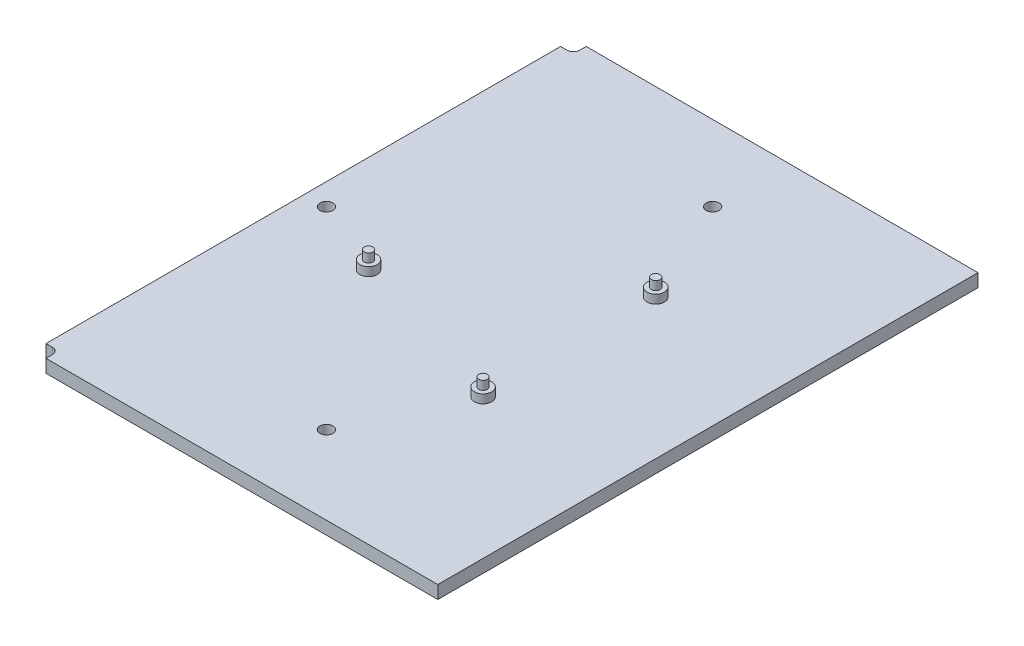
ISO-10303-21;
HEADER;
FILE_DESCRIPTION(('STEP AP214'),'2;1');
FILE_NAME('part.step','',(''),(''),'','','');
FILE_SCHEMA(('AUTOMOTIVE_DESIGN { 1 0 10303 214 1 1 1 1 }'));
ENDSEC;
DATA;
#1=APPLICATION_CONTEXT('core data for automotive mechanical design processes');
#2=APPLICATION_PROTOCOL_DEFINITION('international standard','automotive_design',2000,#1);
#3=PRODUCT_CONTEXT('',#1,'mechanical');
#4=PRODUCT('Part','Part','',(#3));
#5=PRODUCT_RELATED_PRODUCT_CATEGORY('part','',(#4));
#6=PRODUCT_DEFINITION_FORMATION('','',#4);
#7=PRODUCT_DEFINITION_CONTEXT('part definition',#1,'design');
#8=PRODUCT_DEFINITION('design','',#6,#7);
#9=PRODUCT_DEFINITION_SHAPE('','',#8);
#10=(LENGTH_UNIT() NAMED_UNIT(*) SI_UNIT(.MILLI.,.METRE.));
#11=(NAMED_UNIT(*) PLANE_ANGLE_UNIT() SI_UNIT($,.RADIAN.));
#12=(NAMED_UNIT(*) SI_UNIT($,.STERADIAN.) SOLID_ANGLE_UNIT());
#13=UNCERTAINTY_MEASURE_WITH_UNIT(LENGTH_MEASURE(1.E-05),#10,'distance_accuracy_value','');
#14=(GEOMETRIC_REPRESENTATION_CONTEXT(3) GLOBAL_UNCERTAINTY_ASSIGNED_CONTEXT((#13)) GLOBAL_UNIT_ASSIGNED_CONTEXT((#10,
#11,#12)) REPRESENTATION_CONTEXT('',''));
#15=CARTESIAN_POINT('',(0.,0.,0.));
#16=DIRECTION('',(0.,0.,1.));
#17=DIRECTION('',(1.,0.,0.));
#18=AXIS2_PLACEMENT_3D('',#15,#16,#17);
#19=CARTESIAN_POINT('',(-45.125,0.,60.75));
#20=DIRECTION('',(0.,1.,0.));
#21=DIRECTION('',(0.,0.,1.));
#22=AXIS2_PLACEMENT_3D('',#19,#20,#21);
#23=CYLINDRICAL_SURFACE('',#22,1.45);
#24=DIRECTION('',(0.,1.,0.));
#25=VECTOR('',#24,1.);
#26=CARTESIAN_POINT('',(-43.675,0.,60.75));
#27=LINE('',#26,#25);
#28=CARTESIAN_POINT('',(-43.675,0.,60.75));
#29=VERTEX_POINT('',#28);
#30=CARTESIAN_POINT('',(-43.675,3.,60.75));
#31=VERTEX_POINT('',#30);
#32=EDGE_CURVE('E254',#29,#31,#27,.T.);
#33=ORIENTED_EDGE('',*,*,#32,.T.);
#34=CARTESIAN_POINT('',(-45.125,3.,60.75));
#35=DIRECTION('',(0.,1.,0.));
#36=DIRECTION('',(0.,0.,1.));
#37=AXIS2_PLACEMENT_3D('',#34,#35,#36);
#38=CIRCLE('',#37,1.45);
#39=CARTESIAN_POINT('',(-45.125,3.,59.3));
#40=VERTEX_POINT('',#39);
#41=EDGE_CURVE('E168',#31,#40,#38,.T.);
#42=ORIENTED_EDGE('',*,*,#41,.T.);
#43=DIRECTION('',(0.,1.,0.));
#44=VECTOR('',#43,1.);
#45=CARTESIAN_POINT('',(-45.125,0.,59.3));
#46=LINE('',#45,#44);
#47=CARTESIAN_POINT('',(-45.125,0.,59.3));
#48=VERTEX_POINT('',#47);
#49=EDGE_CURVE('E117',#48,#40,#46,.T.);
#50=ORIENTED_EDGE('',*,*,#49,.F.);
#51=CARTESIAN_POINT('',(-45.125,0.,60.75));
#52=DIRECTION('',(0.,1.,0.));
#53=DIRECTION('',(0.,0.,1.));
#54=AXIS2_PLACEMENT_3D('',#51,#52,#53);
#55=CIRCLE('',#54,1.45);
#56=EDGE_CURVE('E128',#29,#48,#55,.T.);
#57=ORIENTED_EDGE('',*,*,#56,.F.);
#58=EDGE_LOOP('',(#33,#42,#50,#57));
#59=FACE_BOUND('',#58,.T.);
#60=ADVANCED_FACE('F33',(#59),#23,.F.);
#61=CARTESIAN_POINT('',(-45.125,0.,-60.75));
#62=DIRECTION('',(0.,1.,0.));
#63=DIRECTION('',(0.,0.,1.));
#64=AXIS2_PLACEMENT_3D('',#61,#62,#63);
#65=CYLINDRICAL_SURFACE('',#64,1.45);
#66=DIRECTION('',(0.,1.,0.));
#67=VECTOR('',#66,1.);
#68=CARTESIAN_POINT('',(-45.125,0.,-59.3));
#69=LINE('',#68,#67);
#70=CARTESIAN_POINT('',(-45.125,0.,-59.3));
#71=VERTEX_POINT('',#70);
#72=CARTESIAN_POINT('',(-45.125,3.,-59.3));
#73=VERTEX_POINT('',#72);
#74=EDGE_CURVE('E226',#71,#73,#69,.T.);
#75=ORIENTED_EDGE('',*,*,#74,.T.);
#76=CARTESIAN_POINT('',(-45.125,3.,-60.75));
#77=DIRECTION('',(0.,1.,0.));
#78=DIRECTION('',(0.,0.,1.));
#79=AXIS2_PLACEMENT_3D('',#76,#77,#78);
#80=CIRCLE('',#79,1.45);
#81=CARTESIAN_POINT('',(-43.675,3.,-60.75));
#82=VERTEX_POINT('',#81);
#83=EDGE_CURVE('E173',#73,#82,#80,.T.);
#84=ORIENTED_EDGE('',*,*,#83,.T.);
#85=DIRECTION('',(0.,1.,0.));
#86=VECTOR('',#85,1.);
#87=CARTESIAN_POINT('',(-43.675,0.,-60.75));
#88=LINE('',#87,#86);
#89=CARTESIAN_POINT('',(-43.675,0.,-60.75));
#90=VERTEX_POINT('',#89);
#91=EDGE_CURVE('E240',#90,#82,#88,.T.);
#92=ORIENTED_EDGE('',*,*,#91,.F.);
#93=CARTESIAN_POINT('',(-45.125,0.,-60.75));
#94=DIRECTION('',(0.,1.,0.));
#95=DIRECTION('',(0.,0.,1.));
#96=AXIS2_PLACEMENT_3D('',#93,#94,#95);
#97=CIRCLE('',#96,1.45);
#98=EDGE_CURVE('E188',#71,#90,#97,.T.);
#99=ORIENTED_EDGE('',*,*,#98,.F.);
#100=EDGE_LOOP('',(#75,#84,#92,#99));
#101=FACE_BOUND('',#100,.T.);
#102=ADVANCED_FACE('F273',(#101),#65,.F.);
#103=CARTESIAN_POINT('',(46.625,3.,62.25));
#104=DIRECTION('',(-1.,0.,0.));
#105=DIRECTION('',(0.,0.,1.));
#106=AXIS2_PLACEMENT_3D('',#103,#104,#105);
#107=PLANE('',#106);
#108=DIRECTION('',(0.,0.,-1.));
#109=VECTOR('',#108,1.);
#110=CARTESIAN_POINT('',(46.625,0.,62.25));
#111=LINE('',#110,#109);
#112=CARTESIAN_POINT('',(46.625,0.,62.25));
#113=VERTEX_POINT('',#112);
#114=CARTESIAN_POINT('',(46.625,0.,-62.25));
#115=VERTEX_POINT('',#114);
#116=EDGE_CURVE('E140',#113,#115,#111,.T.);
#117=ORIENTED_EDGE('',*,*,#116,.T.);
#118=DIRECTION('',(0.,-1.,0.));
#119=VECTOR('',#118,1.);
#120=CARTESIAN_POINT('',(46.625,3.,-62.25));
#121=LINE('',#120,#119);
#122=CARTESIAN_POINT('',(46.625,3.,-62.25));
#123=VERTEX_POINT('',#122);
#124=EDGE_CURVE('E147',#123,#115,#121,.T.);
#125=ORIENTED_EDGE('',*,*,#124,.F.);
#126=DIRECTION('',(0.,0.,-1.));
#127=VECTOR('',#126,1.);
#128=CARTESIAN_POINT('',(46.625,3.,62.25));
#129=LINE('',#128,#127);
#130=CARTESIAN_POINT('',(46.625,3.,62.25));
#131=VERTEX_POINT('',#130);
#132=EDGE_CURVE('E137',#131,#123,#129,.T.);
#133=ORIENTED_EDGE('',*,*,#132,.F.);
#134=DIRECTION('',(0.,-1.,0.));
#135=VECTOR('',#134,1.);
#136=CARTESIAN_POINT('',(46.625,3.,62.25));
#137=LINE('',#136,#135);
#138=EDGE_CURVE('E144',#131,#113,#137,.T.);
#139=ORIENTED_EDGE('',*,*,#138,.T.);
#140=EDGE_LOOP('',(#117,#125,#133,#139));
#141=FACE_BOUND('',#140,.T.);
#142=ADVANCED_FACE('F35',(#141),#107,.F.);
#143=CARTESIAN_POINT('',(-46.625,3.,-62.25));
#144=DIRECTION('',(0.,0.,1.));
#145=DIRECTION('',(1.,0.,0.));
#146=AXIS2_PLACEMENT_3D('',#143,#144,#145);
#147=PLANE('',#146);
#148=DIRECTION('',(-1.,0.,0.));
#149=VECTOR('',#148,1.);
#150=CARTESIAN_POINT('',(-46.625,0.,-62.25));
#151=LINE('',#150,#149);
#152=CARTESIAN_POINT('',(-43.675,0.,-62.25));
#153=VERTEX_POINT('',#152);
#154=EDGE_CURVE('E135',#115,#153,#151,.T.);
#155=ORIENTED_EDGE('',*,*,#154,.T.);
#156=DIRECTION('',(0.,1.,0.));
#157=VECTOR('',#156,1.);
#158=CARTESIAN_POINT('',(-43.675,0.,-62.25));
#159=LINE('',#158,#157);
#160=CARTESIAN_POINT('',(-43.675,3.,-62.25));
#161=VERTEX_POINT('',#160);
#162=EDGE_CURVE('E242',#153,#161,#159,.T.);
#163=ORIENTED_EDGE('',*,*,#162,.T.);
#164=DIRECTION('',(-1.,0.,0.));
#165=VECTOR('',#164,1.);
#166=CARTESIAN_POINT('',(-46.625,3.,-62.25));
#167=LINE('',#166,#165);
#168=EDGE_CURVE('E182',#123,#161,#167,.T.);
#169=ORIENTED_EDGE('',*,*,#168,.F.);
#170=ORIENTED_EDGE('',*,*,#124,.T.);
#171=EDGE_LOOP('',(#155,#163,#169,#170));
#172=FACE_BOUND('',#171,.T.);
#173=ADVANCED_FACE('F289',(#172),#147,.F.);
#174=CARTESIAN_POINT('',(-46.625,3.,62.25));
#175=DIRECTION('',(1.,0.,0.));
#176=DIRECTION('',(0.,0.,-1.));
#177=AXIS2_PLACEMENT_3D('',#174,#175,#176);
#178=PLANE('',#177);
#179=DIRECTION('',(0.,0.,1.));
#180=VECTOR('',#179,1.);
#181=CARTESIAN_POINT('',(-46.625,0.,62.25));
#182=LINE('',#181,#180);
#183=CARTESIAN_POINT('',(-46.625,0.,-59.3));
#184=VERTEX_POINT('',#183);
#185=CARTESIAN_POINT('',(-46.625,0.,59.3));
#186=VERTEX_POINT('',#185);
#187=EDGE_CURVE('E126',#184,#186,#182,.T.);
#188=ORIENTED_EDGE('',*,*,#187,.T.);
#189=DIRECTION('',(0.,1.,0.));
#190=VECTOR('',#189,1.);
#191=CARTESIAN_POINT('',(-46.625,0.,59.3));
#192=LINE('',#191,#190);
#193=CARTESIAN_POINT('',(-46.625,3.,59.3));
#194=VERTEX_POINT('',#193);
#195=EDGE_CURVE('E108',#186,#194,#192,.T.);
#196=ORIENTED_EDGE('',*,*,#195,.T.);
#197=DIRECTION('',(0.,0.,1.));
#198=VECTOR('',#197,1.);
#199=CARTESIAN_POINT('',(-46.625,3.,62.25));
#200=LINE('',#199,#198);
#201=CARTESIAN_POINT('',(-46.625,3.,-59.3));
#202=VERTEX_POINT('',#201);
#203=EDGE_CURVE('E185',#202,#194,#200,.T.);
#204=ORIENTED_EDGE('',*,*,#203,.F.);
#205=DIRECTION('',(0.,1.,0.));
#206=VECTOR('',#205,1.);
#207=CARTESIAN_POINT('',(-46.625,0.,-59.3));
#208=LINE('',#207,#206);
#209=EDGE_CURVE('E133',#184,#202,#208,.T.);
#210=ORIENTED_EDGE('',*,*,#209,.F.);
#211=EDGE_LOOP('',(#188,#196,#204,#210));
#212=FACE_BOUND('',#211,.T.);
#213=ADVANCED_FACE('F132',(#212),#178,.F.);
#214=CARTESIAN_POINT('',(-46.625,3.,62.25));
#215=DIRECTION('',(0.,0.,-1.));
#216=DIRECTION('',(-1.,0.,0.));
#217=AXIS2_PLACEMENT_3D('',#214,#215,#216);
#218=PLANE('',#217);
#219=DIRECTION('',(1.,0.,0.));
#220=VECTOR('',#219,1.);
#221=CARTESIAN_POINT('',(-46.625,3.,62.25));
#222=LINE('',#221,#220);
#223=CARTESIAN_POINT('',(-43.675,3.,62.25));
#224=VERTEX_POINT('',#223);
#225=EDGE_CURVE('E148',#224,#131,#222,.T.);
#226=ORIENTED_EDGE('',*,*,#225,.F.);
#227=DIRECTION('',(0.,1.,0.));
#228=VECTOR('',#227,1.);
#229=CARTESIAN_POINT('',(-43.675,0.,62.25));
#230=LINE('',#229,#228);
#231=CARTESIAN_POINT('',(-43.675,0.,62.25));
#232=VERTEX_POINT('',#231);
#233=EDGE_CURVE('E116',#232,#224,#230,.T.);
#234=ORIENTED_EDGE('',*,*,#233,.F.);
#235=DIRECTION('',(1.,0.,0.));
#236=VECTOR('',#235,1.);
#237=CARTESIAN_POINT('',(-46.625,0.,62.25));
#238=LINE('',#237,#236);
#239=EDGE_CURVE('E134',#232,#113,#238,.T.);
#240=ORIENTED_EDGE('',*,*,#239,.T.);
#241=ORIENTED_EDGE('',*,*,#138,.F.);
#242=EDGE_LOOP('',(#226,#234,#240,#241));
#243=FACE_BOUND('',#242,.T.);
#244=ADVANCED_FACE('F161',(#243),#218,.F.);
#245=CARTESIAN_POINT('',(0.,3.,0.));
#246=DIRECTION('',(0.,-1.,0.));
#247=DIRECTION('',(0.,0.,-1.));
#248=AXIS2_PLACEMENT_3D('',#245,#246,#247);
#249=PLANE('',#248);
#250=CARTESIAN_POINT('',(2.87500000000004,3.,-44.832713736537));
#251=DIRECTION('',(0.,1.,0.));
#252=DIRECTION('',(0.,0.,1.));
#253=AXIS2_PLACEMENT_3D('',#250,#251,#252);
#254=CIRCLE('',#253,1.5);
#255=CARTESIAN_POINT('',(2.87500000000004,3.,-43.332713736537));
#256=VERTEX_POINT('',#255);
#257=EDGE_CURVE('E235',#256,#256,#254,.T.);
#258=ORIENTED_EDGE('',*,*,#257,.F.);
#259=EDGE_LOOP('',(#258));
#260=FACE_BOUND('',#259,.T.);
#261=CARTESIAN_POINT('',(-41.625,3.,-0.332713736536822));
#262=DIRECTION('',(0.,1.,0.));
#263=DIRECTION('',(0.,0.,1.));
#264=AXIS2_PLACEMENT_3D('',#261,#262,#263);
#265=CIRCLE('',#264,1.5);
#266=CARTESIAN_POINT('',(-41.625,3.,1.16728626346318));
#267=VERTEX_POINT('',#266);
#268=EDGE_CURVE('E229',#267,#267,#265,.T.);
#269=ORIENTED_EDGE('',*,*,#268,.F.);
#270=EDGE_LOOP('',(#269));
#271=FACE_BOUND('',#270,.T.);
#272=CARTESIAN_POINT('',(2.87500000000036,3.,44.167286263463));
#273=DIRECTION('',(0.,1.,0.));
#274=DIRECTION('',(0.,0.,1.));
#275=AXIS2_PLACEMENT_3D('',#272,#273,#274);
#276=CIRCLE('',#275,1.5);
#277=CARTESIAN_POINT('',(2.87500000000036,3.,45.667286263463));
#278=VERTEX_POINT('',#277);
#279=EDGE_CURVE('E222',#278,#278,#276,.T.);
#280=ORIENTED_EDGE('',*,*,#279,.F.);
#281=EDGE_LOOP('',(#280));
#282=FACE_BOUND('',#281,.T.);
#283=CARTESIAN_POINT('',(14.375,3.,19.567286263463));
#284=DIRECTION('',(0.,-1.,0.));
#285=DIRECTION('',(0.,0.,-1.));
#286=AXIS2_PLACEMENT_3D('',#283,#284,#285);
#287=CIRCLE('',#286,2.);
#288=CARTESIAN_POINT('',(14.375,3.,17.567286263463));
#289=VERTEX_POINT('',#288);
#290=EDGE_CURVE('E11',#289,#289,#287,.F.);
#291=ORIENTED_EDGE('',*,*,#290,.F.);
#292=EDGE_LOOP('',(#291));
#293=FACE_BOUND('',#292,.T.);
#294=CARTESIAN_POINT('',(14.375,3.,-20.232713736537));
#295=DIRECTION('',(0.,-1.,0.));
#296=DIRECTION('',(0.,0.,-1.));
#297=AXIS2_PLACEMENT_3D('',#294,#295,#296);
#298=CIRCLE('',#297,2.);
#299=CARTESIAN_POINT('',(14.375,3.,-22.232713736537));
#300=VERTEX_POINT('',#299);
#301=EDGE_CURVE('E41',#300,#300,#298,.F.);
#302=ORIENTED_EDGE('',*,*,#301,.F.);
#303=EDGE_LOOP('',(#302));
#304=FACE_BOUND('',#303,.T.);
#305=CARTESIAN_POINT('',(-24.225,3.,7.36728626346302));
#306=DIRECTION('',(0.,-1.,0.));
#307=DIRECTION('',(0.,0.,-1.));
#308=AXIS2_PLACEMENT_3D('',#305,#306,#307);
#309=CIRCLE('',#308,2.);
#310=CARTESIAN_POINT('',(-24.225,3.,5.36728626346302));
#311=VERTEX_POINT('',#310);
#312=EDGE_CURVE('E151',#311,#311,#309,.F.);
#313=ORIENTED_EDGE('',*,*,#312,.F.);
#314=EDGE_LOOP('',(#313));
#315=FACE_BOUND('',#314,.T.);
#316=ORIENTED_EDGE('',*,*,#41,.F.);
#317=DIRECTION('',(0.,0.,-1.));
#318=VECTOR('',#317,1.);
#319=CARTESIAN_POINT('',(-43.675,3.,62.25));
#320=LINE('',#319,#318);
#321=EDGE_CURVE('E48',#224,#31,#320,.T.);
#322=ORIENTED_EDGE('',*,*,#321,.F.);
#323=ORIENTED_EDGE('',*,*,#225,.T.);
#324=ORIENTED_EDGE('',*,*,#132,.T.);
#325=ORIENTED_EDGE('',*,*,#168,.T.);
#326=DIRECTION('',(0.,0.,-1.));
#327=VECTOR('',#326,1.);
#328=CARTESIAN_POINT('',(-43.675,3.,-62.25));
#329=LINE('',#328,#327);
#330=EDGE_CURVE('E252',#82,#161,#329,.T.);
#331=ORIENTED_EDGE('',*,*,#330,.F.);
#332=ORIENTED_EDGE('',*,*,#83,.F.);
#333=DIRECTION('',(1.,0.,0.));
#334=VECTOR('',#333,1.);
#335=CARTESIAN_POINT('',(-45.125,3.,-59.3));
#336=LINE('',#335,#334);
#337=EDGE_CURVE('E249',#202,#73,#336,.T.);
#338=ORIENTED_EDGE('',*,*,#337,.F.);
#339=ORIENTED_EDGE('',*,*,#203,.T.);
#340=DIRECTION('',(-1.,0.,0.));
#341=VECTOR('',#340,1.);
#342=CARTESIAN_POINT('',(-45.125,3.,59.3));
#343=LINE('',#342,#341);
#344=EDGE_CURVE('E111',#40,#194,#343,.T.);
#345=ORIENTED_EDGE('',*,*,#344,.F.);
#346=EDGE_LOOP('',(#316,#322,#323,#324,#325,#331,#332,#338,#339,#345));
#347=FACE_BOUND('',#346,.T.);
#348=ADVANCED_FACE('F158',(#260,#271,#282,#293,#304,#315,#347),#249,.F.);
#349=CARTESIAN_POINT('',(0.,0.,0.));
#350=DIRECTION('',(0.,-1.,0.));
#351=DIRECTION('',(0.,0.,-1.));
#352=AXIS2_PLACEMENT_3D('',#349,#350,#351);
#353=PLANE('',#352);
#354=DIRECTION('',(0.,0.,-1.));
#355=VECTOR('',#354,1.);
#356=CARTESIAN_POINT('',(-43.675,0.,62.25));
#357=LINE('',#356,#355);
#358=EDGE_CURVE('E129',#232,#29,#357,.T.);
#359=ORIENTED_EDGE('',*,*,#358,.T.);
#360=ORIENTED_EDGE('',*,*,#56,.T.);
#361=DIRECTION('',(-1.,0.,0.));
#362=VECTOR('',#361,1.);
#363=CARTESIAN_POINT('',(-45.125,0.,59.3));
#364=LINE('',#363,#362);
#365=EDGE_CURVE('E56',#48,#186,#364,.T.);
#366=ORIENTED_EDGE('',*,*,#365,.T.);
#367=ORIENTED_EDGE('',*,*,#187,.F.);
#368=DIRECTION('',(1.,0.,0.));
#369=VECTOR('',#368,1.);
#370=CARTESIAN_POINT('',(-45.125,0.,-59.3));
#371=LINE('',#370,#369);
#372=EDGE_CURVE('E243',#184,#71,#371,.T.);
#373=ORIENTED_EDGE('',*,*,#372,.T.);
#374=ORIENTED_EDGE('',*,*,#98,.T.);
#375=DIRECTION('',(0.,0.,-1.));
#376=VECTOR('',#375,1.);
#377=CARTESIAN_POINT('',(-43.675,0.,-62.25));
#378=LINE('',#377,#376);
#379=EDGE_CURVE('E251',#90,#153,#378,.T.);
#380=ORIENTED_EDGE('',*,*,#379,.T.);
#381=ORIENTED_EDGE('',*,*,#154,.F.);
#382=ORIENTED_EDGE('',*,*,#116,.F.);
#383=ORIENTED_EDGE('',*,*,#239,.F.);
#384=EDGE_LOOP('',(#359,#360,#366,#367,#373,#374,#380,#381,#382,#383));
#385=FACE_BOUND('',#384,.T.);
#386=CARTESIAN_POINT('',(2.87500000000004,0.,-44.832713736537));
#387=DIRECTION('',(0.,1.,0.));
#388=DIRECTION('',(0.,0.,1.));
#389=AXIS2_PLACEMENT_3D('',#386,#387,#388);
#390=CIRCLE('',#389,1.5);
#391=CARTESIAN_POINT('',(2.87500000000004,0.,-43.332713736537));
#392=VERTEX_POINT('',#391);
#393=EDGE_CURVE('E221',#392,#392,#390,.T.);
#394=ORIENTED_EDGE('',*,*,#393,.T.);
#395=EDGE_LOOP('',(#394));
#396=FACE_BOUND('',#395,.T.);
#397=CARTESIAN_POINT('',(-41.625,0.,-0.332713736536822));
#398=DIRECTION('',(0.,1.,0.));
#399=DIRECTION('',(0.,0.,1.));
#400=AXIS2_PLACEMENT_3D('',#397,#398,#399);
#401=CIRCLE('',#400,1.5);
#402=CARTESIAN_POINT('',(-41.625,0.,1.16728626346318));
#403=VERTEX_POINT('',#402);
#404=EDGE_CURVE('E232',#403,#403,#401,.T.);
#405=ORIENTED_EDGE('',*,*,#404,.T.);
#406=EDGE_LOOP('',(#405));
#407=FACE_BOUND('',#406,.T.);
#408=CARTESIAN_POINT('',(2.87500000000036,0.,44.167286263463));
#409=DIRECTION('',(0.,1.,0.));
#410=DIRECTION('',(0.,0.,1.));
#411=AXIS2_PLACEMENT_3D('',#408,#409,#410);
#412=CIRCLE('',#411,1.5);
#413=CARTESIAN_POINT('',(2.87500000000036,0.,45.667286263463));
#414=VERTEX_POINT('',#413);
#415=EDGE_CURVE('E225',#414,#414,#412,.T.);
#416=ORIENTED_EDGE('',*,*,#415,.T.);
#417=EDGE_LOOP('',(#416));
#418=FACE_BOUND('',#417,.T.);
#419=ADVANCED_FACE('F123',(#385,#396,#407,#418),#353,.T.);
#420=CARTESIAN_POINT('',(-24.225,5.,7.36728626346302));
#421=DIRECTION('',(0.,1.,0.));
#422=DIRECTION('',(0.,0.,1.));
#423=AXIS2_PLACEMENT_3D('',#420,#421,#422);
#424=PLANE('',#423);
#425=CARTESIAN_POINT('',(-24.225,5.,7.36728626346302));
#426=DIRECTION('',(0.,1.,0.));
#427=DIRECTION('',(0.,0.,1.));
#428=AXIS2_PLACEMENT_3D('',#425,#426,#427);
#429=CIRCLE('',#428,2.);
#430=CARTESIAN_POINT('',(-24.225,5.,9.36728626346303));
#431=VERTEX_POINT('',#430);
#432=EDGE_CURVE('E171',#431,#431,#429,.T.);
#433=ORIENTED_EDGE('',*,*,#432,.T.);
#434=EDGE_LOOP('',(#433));
#435=FACE_BOUND('',#434,.T.);
#436=CARTESIAN_POINT('',(-24.225,5.,7.36728626346302));
#437=DIRECTION('',(0.,1.,0.));
#438=DIRECTION('',(0.,0.,1.));
#439=AXIS2_PLACEMENT_3D('',#436,#437,#438);
#440=CIRCLE('',#439,1.);
#441=CARTESIAN_POINT('',(-24.225,5.,8.36728626346303));
#442=VERTEX_POINT('',#441);
#443=EDGE_CURVE('E176',#442,#442,#440,.T.);
#444=ORIENTED_EDGE('',*,*,#443,.F.);
#445=EDGE_LOOP('',(#444));
#446=FACE_BOUND('',#445,.T.);
#447=ADVANCED_FACE('F284',(#435,#446),#424,.T.);
#448=CARTESIAN_POINT('',(-24.225,5.,7.36728626346302));
#449=DIRECTION('',(0.,-1.,0.));
#450=DIRECTION('',(0.,0.,-1.));
#451=AXIS2_PLACEMENT_3D('',#448,#449,#450);
#452=CYLINDRICAL_SURFACE('',#451,2.);
#453=ORIENTED_EDGE('',*,*,#432,.F.);
#454=EDGE_LOOP('',(#453));
#455=FACE_BOUND('',#454,.T.);
#456=ORIENTED_EDGE('',*,*,#312,.T.);
#457=EDGE_LOOP('',(#456));
#458=FACE_BOUND('',#457,.T.);
#459=ADVANCED_FACE('F358',(#455,#458),#452,.T.);
#460=CARTESIAN_POINT('',(14.375,5.,-20.232713736537));
#461=DIRECTION('',(0.,1.,0.));
#462=DIRECTION('',(0.,0.,1.));
#463=AXIS2_PLACEMENT_3D('',#460,#461,#462);
#464=PLANE('',#463);
#465=CARTESIAN_POINT('',(14.375,5.,-20.232713736537));
#466=DIRECTION('',(0.,1.,0.));
#467=DIRECTION('',(0.,0.,1.));
#468=AXIS2_PLACEMENT_3D('',#465,#466,#467);
#469=CIRCLE('',#468,2.);
#470=CARTESIAN_POINT('',(14.375,5.,-18.232713736537));
#471=VERTEX_POINT('',#470);
#472=EDGE_CURVE('E200',#471,#471,#469,.T.);
#473=ORIENTED_EDGE('',*,*,#472,.T.);
#474=EDGE_LOOP('',(#473));
#475=FACE_BOUND('',#474,.T.);
#476=CARTESIAN_POINT('',(14.375,5.,-20.232713736537));
#477=DIRECTION('',(0.,1.,0.));
#478=DIRECTION('',(0.,0.,1.));
#479=AXIS2_PLACEMENT_3D('',#476,#477,#478);
#480=CIRCLE('',#479,1.);
#481=CARTESIAN_POINT('',(14.375,5.,-19.232713736537));
#482=VERTEX_POINT('',#481);
#483=EDGE_CURVE('E203',#482,#482,#480,.T.);
#484=ORIENTED_EDGE('',*,*,#483,.F.);
#485=EDGE_LOOP('',(#484));
#486=FACE_BOUND('',#485,.T.);
#487=ADVANCED_FACE('F355',(#475,#486),#464,.T.);
#488=CARTESIAN_POINT('',(14.375,5.,-20.232713736537));
#489=DIRECTION('',(0.,-1.,0.));
#490=DIRECTION('',(0.,0.,-1.));
#491=AXIS2_PLACEMENT_3D('',#488,#489,#490);
#492=CYLINDRICAL_SURFACE('',#491,2.);
#493=ORIENTED_EDGE('',*,*,#472,.F.);
#494=EDGE_LOOP('',(#493));
#495=FACE_BOUND('',#494,.T.);
#496=ORIENTED_EDGE('',*,*,#301,.T.);
#497=EDGE_LOOP('',(#496));
#498=FACE_BOUND('',#497,.T.);
#499=ADVANCED_FACE('F156',(#495,#498),#492,.T.);
#500=CARTESIAN_POINT('',(14.375,5.,19.567286263463));
#501=DIRECTION('',(0.,1.,0.));
#502=DIRECTION('',(0.,0.,1.));
#503=AXIS2_PLACEMENT_3D('',#500,#501,#502);
#504=PLANE('',#503);
#505=CARTESIAN_POINT('',(14.375,5.,19.567286263463));
#506=DIRECTION('',(0.,1.,0.));
#507=DIRECTION('',(0.,0.,1.));
#508=AXIS2_PLACEMENT_3D('',#505,#506,#507);
#509=CIRCLE('',#508,2.);
#510=CARTESIAN_POINT('',(14.375,5.,21.567286263463));
#511=VERTEX_POINT('',#510);
#512=EDGE_CURVE('E206',#511,#511,#509,.T.);
#513=ORIENTED_EDGE('',*,*,#512,.T.);
#514=EDGE_LOOP('',(#513));
#515=FACE_BOUND('',#514,.T.);
#516=CARTESIAN_POINT('',(14.375,5.,19.567286263463));
#517=DIRECTION('',(0.,1.,0.));
#518=DIRECTION('',(0.,0.,1.));
#519=AXIS2_PLACEMENT_3D('',#516,#517,#518);
#520=CIRCLE('',#519,1.);
#521=CARTESIAN_POINT('',(14.375,5.,20.567286263463));
#522=VERTEX_POINT('',#521);
#523=EDGE_CURVE('E209',#522,#522,#520,.T.);
#524=ORIENTED_EDGE('',*,*,#523,.F.);
#525=EDGE_LOOP('',(#524));
#526=FACE_BOUND('',#525,.T.);
#527=ADVANCED_FACE('F348',(#515,#526),#504,.T.);
#528=CARTESIAN_POINT('',(14.375,5.,19.567286263463));
#529=DIRECTION('',(0.,-1.,0.));
#530=DIRECTION('',(0.,0.,-1.));
#531=AXIS2_PLACEMENT_3D('',#528,#529,#530);
#532=CYLINDRICAL_SURFACE('',#531,2.);
#533=ORIENTED_EDGE('',*,*,#512,.F.);
#534=EDGE_LOOP('',(#533));
#535=FACE_BOUND('',#534,.T.);
#536=ORIENTED_EDGE('',*,*,#290,.T.);
#537=EDGE_LOOP('',(#536));
#538=FACE_BOUND('',#537,.T.);
#539=ADVANCED_FACE('F346',(#535,#538),#532,.T.);
#540=CARTESIAN_POINT('',(-24.225,7.,7.36728626346302));
#541=DIRECTION('',(0.,-1.,0.));
#542=DIRECTION('',(0.,0.,-1.));
#543=AXIS2_PLACEMENT_3D('',#540,#541,#542);
#544=CYLINDRICAL_SURFACE('',#543,1.);
#545=ORIENTED_EDGE('',*,*,#443,.T.);
#546=EDGE_LOOP('',(#545));
#547=FACE_BOUND('',#546,.T.);
#548=CARTESIAN_POINT('',(-24.225,7.,7.36728626346302));
#549=DIRECTION('',(0.,1.,0.));
#550=DIRECTION('',(0.,0.,1.));
#551=AXIS2_PLACEMENT_3D('',#548,#549,#550);
#552=CIRCLE('',#551,1.);
#553=CARTESIAN_POINT('',(-24.225,7.,8.36728626346303));
#554=VERTEX_POINT('',#553);
#555=EDGE_CURVE('E212',#554,#554,#552,.T.);
#556=ORIENTED_EDGE('',*,*,#555,.F.);
#557=EDGE_LOOP('',(#556));
#558=FACE_BOUND('',#557,.T.);
#559=ADVANCED_FACE('F342',(#547,#558),#544,.T.);
#560=CARTESIAN_POINT('',(-24.225,7.,7.36728626346302));
#561=DIRECTION('',(0.,1.,0.));
#562=DIRECTION('',(0.,0.,1.));
#563=AXIS2_PLACEMENT_3D('',#560,#561,#562);
#564=PLANE('',#563);
#565=ORIENTED_EDGE('',*,*,#555,.T.);
#566=EDGE_LOOP('',(#565));
#567=FACE_BOUND('',#566,.T.);
#568=ADVANCED_FACE('F338',(#567),#564,.T.);
#569=CARTESIAN_POINT('',(14.375,7.,-20.232713736537));
#570=DIRECTION('',(0.,-1.,0.));
#571=DIRECTION('',(0.,0.,-1.));
#572=AXIS2_PLACEMENT_3D('',#569,#570,#571);
#573=CYLINDRICAL_SURFACE('',#572,1.);
#574=ORIENTED_EDGE('',*,*,#483,.T.);
#575=EDGE_LOOP('',(#574));
#576=FACE_BOUND('',#575,.T.);
#577=CARTESIAN_POINT('',(14.375,7.,-20.232713736537));
#578=DIRECTION('',(0.,1.,0.));
#579=DIRECTION('',(0.,0.,1.));
#580=AXIS2_PLACEMENT_3D('',#577,#578,#579);
#581=CIRCLE('',#580,1.);
#582=CARTESIAN_POINT('',(14.375,7.,-19.232713736537));
#583=VERTEX_POINT('',#582);
#584=EDGE_CURVE('E215',#583,#583,#581,.T.);
#585=ORIENTED_EDGE('',*,*,#584,.F.);
#586=EDGE_LOOP('',(#585));
#587=FACE_BOUND('',#586,.T.);
#588=ADVANCED_FACE('F334',(#576,#587),#573,.T.);
#589=CARTESIAN_POINT('',(14.375,7.,-20.232713736537));
#590=DIRECTION('',(0.,1.,0.));
#591=DIRECTION('',(0.,0.,1.));
#592=AXIS2_PLACEMENT_3D('',#589,#590,#591);
#593=PLANE('',#592);
#594=ORIENTED_EDGE('',*,*,#584,.T.);
#595=EDGE_LOOP('',(#594));
#596=FACE_BOUND('',#595,.T.);
#597=ADVANCED_FACE('F330',(#596),#593,.T.);
#598=CARTESIAN_POINT('',(14.375,7.,19.567286263463));
#599=DIRECTION('',(0.,-1.,0.));
#600=DIRECTION('',(0.,0.,-1.));
#601=AXIS2_PLACEMENT_3D('',#598,#599,#600);
#602=CYLINDRICAL_SURFACE('',#601,1.);
#603=ORIENTED_EDGE('',*,*,#523,.T.);
#604=EDGE_LOOP('',(#603));
#605=FACE_BOUND('',#604,.T.);
#606=CARTESIAN_POINT('',(14.375,7.,19.567286263463));
#607=DIRECTION('',(0.,1.,0.));
#608=DIRECTION('',(0.,0.,1.));
#609=AXIS2_PLACEMENT_3D('',#606,#607,#608);
#610=CIRCLE('',#609,1.);
#611=CARTESIAN_POINT('',(14.375,7.,20.567286263463));
#612=VERTEX_POINT('',#611);
#613=EDGE_CURVE('E218',#612,#612,#610,.T.);
#614=ORIENTED_EDGE('',*,*,#613,.F.);
#615=EDGE_LOOP('',(#614));
#616=FACE_BOUND('',#615,.T.);
#617=ADVANCED_FACE('F326',(#605,#616),#602,.T.);
#618=CARTESIAN_POINT('',(14.375,7.,19.567286263463));
#619=DIRECTION('',(0.,1.,0.));
#620=DIRECTION('',(0.,0.,1.));
#621=AXIS2_PLACEMENT_3D('',#618,#619,#620);
#622=PLANE('',#621);
#623=ORIENTED_EDGE('',*,*,#613,.T.);
#624=EDGE_LOOP('',(#623));
#625=FACE_BOUND('',#624,.T.);
#626=ADVANCED_FACE('F322',(#625),#622,.T.);
#627=CARTESIAN_POINT('',(2.87500000000036,0.,44.167286263463));
#628=DIRECTION('',(0.,1.,0.));
#629=DIRECTION('',(0.,0.,1.));
#630=AXIS2_PLACEMENT_3D('',#627,#628,#629);
#631=CYLINDRICAL_SURFACE('',#630,1.5);
#632=ORIENTED_EDGE('',*,*,#415,.F.);
#633=EDGE_LOOP('',(#632));
#634=FACE_BOUND('',#633,.T.);
#635=ORIENTED_EDGE('',*,*,#279,.T.);
#636=EDGE_LOOP('',(#635));
#637=FACE_BOUND('',#636,.T.);
#638=ADVANCED_FACE('F318',(#634,#637),#631,.F.);
#639=CARTESIAN_POINT('',(-41.625,0.,-0.332713736536822));
#640=DIRECTION('',(0.,1.,0.));
#641=DIRECTION('',(0.,0.,1.));
#642=AXIS2_PLACEMENT_3D('',#639,#640,#641);
#643=CYLINDRICAL_SURFACE('',#642,1.5);
#644=ORIENTED_EDGE('',*,*,#404,.F.);
#645=EDGE_LOOP('',(#644));
#646=FACE_BOUND('',#645,.T.);
#647=ORIENTED_EDGE('',*,*,#268,.T.);
#648=EDGE_LOOP('',(#647));
#649=FACE_BOUND('',#648,.T.);
#650=ADVANCED_FACE('F314',(#646,#649),#643,.F.);
#651=CARTESIAN_POINT('',(2.87500000000004,0.,-44.832713736537));
#652=DIRECTION('',(0.,1.,0.));
#653=DIRECTION('',(0.,0.,1.));
#654=AXIS2_PLACEMENT_3D('',#651,#652,#653);
#655=CYLINDRICAL_SURFACE('',#654,1.5);
#656=ORIENTED_EDGE('',*,*,#393,.F.);
#657=EDGE_LOOP('',(#656));
#658=FACE_BOUND('',#657,.T.);
#659=ORIENTED_EDGE('',*,*,#257,.T.);
#660=EDGE_LOOP('',(#659));
#661=FACE_BOUND('',#660,.T.);
#662=ADVANCED_FACE('F309',(#658,#661),#655,.F.);
#663=CARTESIAN_POINT('',(-43.675,0.,-62.25));
#664=DIRECTION('',(1.,0.,0.));
#665=DIRECTION('',(0.,0.,-1.));
#666=AXIS2_PLACEMENT_3D('',#663,#664,#665);
#667=PLANE('',#666);
#668=ORIENTED_EDGE('',*,*,#330,.T.);
#669=ORIENTED_EDGE('',*,*,#162,.F.);
#670=ORIENTED_EDGE('',*,*,#379,.F.);
#671=ORIENTED_EDGE('',*,*,#91,.T.);
#672=EDGE_LOOP('',(#668,#669,#670,#671));
#673=FACE_BOUND('',#672,.T.);
#674=ADVANCED_FACE('F297',(#673),#667,.F.);
#675=CARTESIAN_POINT('',(-45.125,0.,-59.3));
#676=DIRECTION('',(0.,0.,1.));
#677=DIRECTION('',(1.,0.,0.));
#678=AXIS2_PLACEMENT_3D('',#675,#676,#677);
#679=PLANE('',#678);
#680=ORIENTED_EDGE('',*,*,#337,.T.);
#681=ORIENTED_EDGE('',*,*,#74,.F.);
#682=ORIENTED_EDGE('',*,*,#372,.F.);
#683=ORIENTED_EDGE('',*,*,#209,.T.);
#684=EDGE_LOOP('',(#680,#681,#682,#683));
#685=FACE_BOUND('',#684,.T.);
#686=ADVANCED_FACE('F270',(#685),#679,.F.);
#687=CARTESIAN_POINT('',(-45.125,0.,59.3));
#688=DIRECTION('',(0.,0.,-1.));
#689=DIRECTION('',(-1.,0.,0.));
#690=AXIS2_PLACEMENT_3D('',#687,#688,#689);
#691=PLANE('',#690);
#692=ORIENTED_EDGE('',*,*,#344,.T.);
#693=ORIENTED_EDGE('',*,*,#195,.F.);
#694=ORIENTED_EDGE('',*,*,#365,.F.);
#695=ORIENTED_EDGE('',*,*,#49,.T.);
#696=EDGE_LOOP('',(#692,#693,#694,#695));
#697=FACE_BOUND('',#696,.T.);
#698=ADVANCED_FACE('F109',(#697),#691,.F.);
#699=CARTESIAN_POINT('',(-43.675,0.,62.25));
#700=DIRECTION('',(1.,0.,0.));
#701=DIRECTION('',(0.,0.,-1.));
#702=AXIS2_PLACEMENT_3D('',#699,#700,#701);
#703=PLANE('',#702);
#704=ORIENTED_EDGE('',*,*,#321,.T.);
#705=ORIENTED_EDGE('',*,*,#32,.F.);
#706=ORIENTED_EDGE('',*,*,#358,.F.);
#707=ORIENTED_EDGE('',*,*,#233,.T.);
#708=EDGE_LOOP('',(#704,#705,#706,#707));
#709=FACE_BOUND('',#708,.T.);
#710=ADVANCED_FACE('F264',(#709),#703,.F.);
#711=CLOSED_SHELL('',(#60,#102,#142,#173,#213,#244,#348,#419,#447,#459,#487,#499,#527,#539,#559,
#568,#588,#597,#617,#626,#638,#650,#662,#674,#686,#698,#710));
#712=MANIFOLD_SOLID_BREP('B2',#711);
#713=ADVANCED_BREP_SHAPE_REPRESENTATION('',(#18,#712),#14);
#714=SHAPE_DEFINITION_REPRESENTATION(#9,#713);
ENDSEC;
END-ISO-10303-21;
